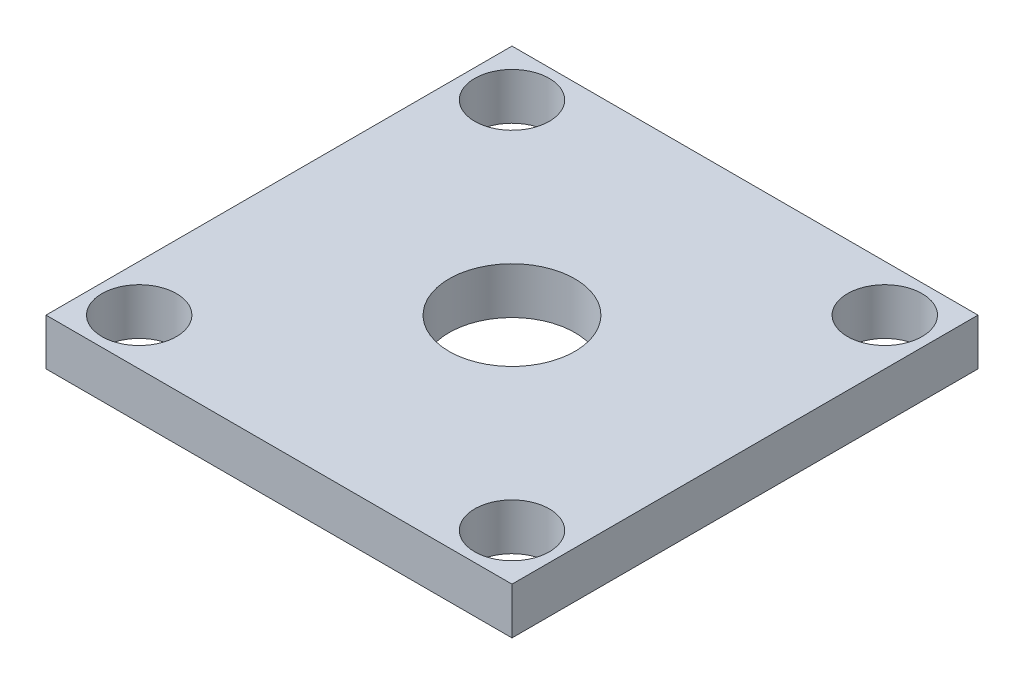
ISO-10303-21;
HEADER;
FILE_DESCRIPTION(('STEP AP214'),'2;1');
FILE_NAME('part.step','',(''),(''),'','','');
FILE_SCHEMA(('AUTOMOTIVE_DESIGN { 1 0 10303 214 1 1 1 1 }'));
ENDSEC;
DATA;
#1=APPLICATION_CONTEXT('core data for automotive mechanical design processes');
#2=APPLICATION_PROTOCOL_DEFINITION('international standard','automotive_design',2000,#1);
#3=PRODUCT_CONTEXT('',#1,'mechanical');
#4=PRODUCT('Part','Part','',(#3));
#5=PRODUCT_RELATED_PRODUCT_CATEGORY('part','',(#4));
#6=PRODUCT_DEFINITION_FORMATION('','',#4);
#7=PRODUCT_DEFINITION_CONTEXT('part definition',#1,'design');
#8=PRODUCT_DEFINITION('design','',#6,#7);
#9=PRODUCT_DEFINITION_SHAPE('','',#8);
#10=(LENGTH_UNIT() NAMED_UNIT(*) SI_UNIT(.MILLI.,.METRE.));
#11=(NAMED_UNIT(*) PLANE_ANGLE_UNIT() SI_UNIT($,.RADIAN.));
#12=(NAMED_UNIT(*) SI_UNIT($,.STERADIAN.) SOLID_ANGLE_UNIT());
#13=UNCERTAINTY_MEASURE_WITH_UNIT(LENGTH_MEASURE(1.E-05),#10,'distance_accuracy_value','');
#14=(GEOMETRIC_REPRESENTATION_CONTEXT(3) GLOBAL_UNCERTAINTY_ASSIGNED_CONTEXT((#13)) GLOBAL_UNIT_ASSIGNED_CONTEXT((#10,
#11,#12)) REPRESENTATION_CONTEXT('',''));
#15=CARTESIAN_POINT('',(0.,0.,0.));
#16=DIRECTION('',(0.,0.,1.));
#17=DIRECTION('',(1.,0.,0.));
#18=AXIS2_PLACEMENT_3D('',#15,#16,#17);
#19=CARTESIAN_POINT('',(0.,1.,5.));
#20=DIRECTION('',(0.,0.,-1.));
#21=DIRECTION('',(-1.,0.,0.));
#22=AXIS2_PLACEMENT_3D('',#19,#20,#21);
#23=PLANE('',#22);
#24=DIRECTION('',(1.,0.,0.));
#25=VECTOR('',#24,1.);
#26=CARTESIAN_POINT('',(0.,0.,5.));
#27=LINE('',#26,#25);
#28=CARTESIAN_POINT('',(-5.,0.,5.));
#29=VERTEX_POINT('',#28);
#30=CARTESIAN_POINT('',(4.99999999999999,0.,5.));
#31=VERTEX_POINT('',#30);
#32=EDGE_CURVE('E115',#29,#31,#27,.T.);
#33=ORIENTED_EDGE('',*,*,#32,.T.);
#34=DIRECTION('',(0.,-1.,0.));
#35=VECTOR('',#34,1.);
#36=CARTESIAN_POINT('',(4.99999999999999,1.,5.));
#37=LINE('',#36,#35);
#38=CARTESIAN_POINT('',(4.99999999999999,1.,5.));
#39=VERTEX_POINT('',#38);
#40=EDGE_CURVE('E11',#39,#31,#37,.T.);
#41=ORIENTED_EDGE('',*,*,#40,.F.);
#42=DIRECTION('',(1.,0.,0.));
#43=VECTOR('',#42,1.);
#44=CARTESIAN_POINT('',(0.,1.,5.));
#45=LINE('',#44,#43);
#46=CARTESIAN_POINT('',(-5.,1.,5.));
#47=VERTEX_POINT('',#46);
#48=EDGE_CURVE('E76',#47,#39,#45,.T.);
#49=ORIENTED_EDGE('',*,*,#48,.F.);
#50=DIRECTION('',(0.,-1.,0.));
#51=VECTOR('',#50,1.);
#52=CARTESIAN_POINT('',(-5.,1.,5.));
#53=LINE('',#52,#51);
#54=EDGE_CURVE('E114',#47,#29,#53,.T.);
#55=ORIENTED_EDGE('',*,*,#54,.T.);
#56=EDGE_LOOP('',(#33,#41,#49,#55));
#57=FACE_BOUND('',#56,.T.);
#58=ADVANCED_FACE('F37',(#57),#23,.F.);
#59=CARTESIAN_POINT('',(4.99999999999999,1.,0.));
#60=DIRECTION('',(1.,0.,0.));
#61=DIRECTION('',(0.,0.,-1.));
#62=AXIS2_PLACEMENT_3D('',#59,#60,#61);
#63=PLANE('',#62);
#64=DIRECTION('',(0.,0.,1.));
#65=VECTOR('',#64,1.);
#66=CARTESIAN_POINT('',(4.99999999999999,0.,0.));
#67=LINE('',#66,#65);
#68=CARTESIAN_POINT('',(4.99999999999999,0.,-5.));
#69=VERTEX_POINT('',#68);
#70=EDGE_CURVE('E85',#69,#31,#67,.T.);
#71=ORIENTED_EDGE('',*,*,#70,.F.);
#72=DIRECTION('',(0.,-1.,0.));
#73=VECTOR('',#72,1.);
#74=CARTESIAN_POINT('',(4.99999999999999,1.,-5.));
#75=LINE('',#74,#73);
#76=CARTESIAN_POINT('',(4.99999999999999,1.,-5.));
#77=VERTEX_POINT('',#76);
#78=EDGE_CURVE('E45',#77,#69,#75,.T.);
#79=ORIENTED_EDGE('',*,*,#78,.F.);
#80=DIRECTION('',(0.,0.,1.));
#81=VECTOR('',#80,1.);
#82=CARTESIAN_POINT('',(4.99999999999999,1.,0.));
#83=LINE('',#82,#81);
#84=EDGE_CURVE('E83',#77,#39,#83,.T.);
#85=ORIENTED_EDGE('',*,*,#84,.T.);
#86=ORIENTED_EDGE('',*,*,#40,.T.);
#87=EDGE_LOOP('',(#71,#79,#85,#86));
#88=FACE_BOUND('',#87,.T.);
#89=ADVANCED_FACE('F82',(#88),#63,.T.);
#90=CARTESIAN_POINT('',(0.,1.,-5.));
#91=DIRECTION('',(0.,0.,-1.));
#92=DIRECTION('',(-1.,0.,0.));
#93=AXIS2_PLACEMENT_3D('',#90,#91,#92);
#94=PLANE('',#93);
#95=DIRECTION('',(1.,0.,0.));
#96=VECTOR('',#95,1.);
#97=CARTESIAN_POINT('',(0.,0.,-5.));
#98=LINE('',#97,#96);
#99=CARTESIAN_POINT('',(-4.99999999999998,0.,-5.));
#100=VERTEX_POINT('',#99);
#101=EDGE_CURVE('E119',#100,#69,#98,.T.);
#102=ORIENTED_EDGE('',*,*,#101,.F.);
#103=DIRECTION('',(0.,-1.,0.));
#104=VECTOR('',#103,1.);
#105=CARTESIAN_POINT('',(-4.99999999999998,1.,-5.));
#106=LINE('',#105,#104);
#107=CARTESIAN_POINT('',(-4.99999999999998,1.,-5.));
#108=VERTEX_POINT('',#107);
#109=EDGE_CURVE('E68',#108,#100,#106,.T.);
#110=ORIENTED_EDGE('',*,*,#109,.F.);
#111=DIRECTION('',(1.,0.,0.));
#112=VECTOR('',#111,1.);
#113=CARTESIAN_POINT('',(0.,1.,-5.));
#114=LINE('',#113,#112);
#115=EDGE_CURVE('E92',#108,#77,#114,.T.);
#116=ORIENTED_EDGE('',*,*,#115,.T.);
#117=ORIENTED_EDGE('',*,*,#78,.T.);
#118=EDGE_LOOP('',(#102,#110,#116,#117));
#119=FACE_BOUND('',#118,.T.);
#120=ADVANCED_FACE('F94',(#119),#94,.T.);
#121=CARTESIAN_POINT('',(-4.,1.,4.00000000000001));
#122=DIRECTION('',(0.,-1.,0.));
#123=DIRECTION('',(0.,0.,-1.));
#124=AXIS2_PLACEMENT_3D('',#121,#122,#123);
#125=CYLINDRICAL_SURFACE('',#124,0.8);
#126=CARTESIAN_POINT('',(-4.,1.,4.00000000000001));
#127=DIRECTION('',(0.,1.,0.));
#128=DIRECTION('',(0.,0.,1.));
#129=AXIS2_PLACEMENT_3D('',#126,#127,#128);
#130=CIRCLE('',#129,0.8);
#131=CARTESIAN_POINT('',(-4.,1.,4.80000000000001));
#132=VERTEX_POINT('',#131);
#133=EDGE_CURVE('E108',#132,#132,#130,.T.);
#134=ORIENTED_EDGE('',*,*,#133,.T.);
#135=EDGE_LOOP('',(#134));
#136=FACE_BOUND('',#135,.T.);
#137=CARTESIAN_POINT('',(-4.,0.,4.00000000000001));
#138=DIRECTION('',(0.,1.,0.));
#139=DIRECTION('',(0.,0.,1.));
#140=AXIS2_PLACEMENT_3D('',#137,#138,#139);
#141=CIRCLE('',#140,0.8);
#142=CARTESIAN_POINT('',(-4.,0.,4.80000000000001));
#143=VERTEX_POINT('',#142);
#144=EDGE_CURVE('E131',#143,#143,#141,.T.);
#145=ORIENTED_EDGE('',*,*,#144,.F.);
#146=EDGE_LOOP('',(#145));
#147=FACE_BOUND('',#146,.T.);
#148=ADVANCED_FACE('F175',(#136,#147),#125,.F.);
#149=CARTESIAN_POINT('',(4.,1.,4.));
#150=DIRECTION('',(0.,-1.,0.));
#151=DIRECTION('',(0.,0.,-1.));
#152=AXIS2_PLACEMENT_3D('',#149,#150,#151);
#153=CYLINDRICAL_SURFACE('',#152,0.800000000000001);
#154=CARTESIAN_POINT('',(4.,1.,4.));
#155=DIRECTION('',(0.,1.,0.));
#156=DIRECTION('',(0.,0.,1.));
#157=AXIS2_PLACEMENT_3D('',#154,#155,#156);
#158=CIRCLE('',#157,0.800000000000001);
#159=CARTESIAN_POINT('',(4.,1.,4.8));
#160=VERTEX_POINT('',#159);
#161=EDGE_CURVE('E105',#160,#160,#158,.T.);
#162=ORIENTED_EDGE('',*,*,#161,.T.);
#163=EDGE_LOOP('',(#162));
#164=FACE_BOUND('',#163,.T.);
#165=CARTESIAN_POINT('',(4.,0.,4.));
#166=DIRECTION('',(0.,1.,0.));
#167=DIRECTION('',(0.,0.,1.));
#168=AXIS2_PLACEMENT_3D('',#165,#166,#167);
#169=CIRCLE('',#168,0.800000000000001);
#170=CARTESIAN_POINT('',(4.,0.,4.8));
#171=VERTEX_POINT('',#170);
#172=EDGE_CURVE('E128',#171,#171,#169,.T.);
#173=ORIENTED_EDGE('',*,*,#172,.F.);
#174=EDGE_LOOP('',(#173));
#175=FACE_BOUND('',#174,.T.);
#176=ADVANCED_FACE('F184',(#164,#175),#153,.F.);
#177=CARTESIAN_POINT('',(4.,1.,-4.00000000000001));
#178=DIRECTION('',(0.,-1.,0.));
#179=DIRECTION('',(0.,0.,-1.));
#180=AXIS2_PLACEMENT_3D('',#177,#178,#179);
#181=CYLINDRICAL_SURFACE('',#180,0.800000000000001);
#182=CARTESIAN_POINT('',(4.,1.,-4.00000000000001));
#183=DIRECTION('',(0.,1.,0.));
#184=DIRECTION('',(0.,0.,1.));
#185=AXIS2_PLACEMENT_3D('',#182,#183,#184);
#186=CIRCLE('',#185,0.800000000000001);
#187=CARTESIAN_POINT('',(4.,1.,-3.2));
#188=VERTEX_POINT('',#187);
#189=EDGE_CURVE('E102',#188,#188,#186,.T.);
#190=ORIENTED_EDGE('',*,*,#189,.T.);
#191=EDGE_LOOP('',(#190));
#192=FACE_BOUND('',#191,.T.);
#193=CARTESIAN_POINT('',(4.,0.,-4.00000000000001));
#194=DIRECTION('',(0.,1.,0.));
#195=DIRECTION('',(0.,0.,1.));
#196=AXIS2_PLACEMENT_3D('',#193,#194,#195);
#197=CIRCLE('',#196,0.800000000000001);
#198=CARTESIAN_POINT('',(4.,0.,-3.2));
#199=VERTEX_POINT('',#198);
#200=EDGE_CURVE('E125',#199,#199,#197,.T.);
#201=ORIENTED_EDGE('',*,*,#200,.F.);
#202=EDGE_LOOP('',(#201));
#203=FACE_BOUND('',#202,.T.);
#204=ADVANCED_FACE('F180',(#192,#203),#181,.F.);
#205=CARTESIAN_POINT('',(-4.,1.,-3.99999999999999));
#206=DIRECTION('',(0.,-1.,0.));
#207=DIRECTION('',(0.,0.,-1.));
#208=AXIS2_PLACEMENT_3D('',#205,#206,#207);
#209=CYLINDRICAL_SURFACE('',#208,0.8);
#210=CARTESIAN_POINT('',(-4.,1.,-3.99999999999999));
#211=DIRECTION('',(0.,1.,0.));
#212=DIRECTION('',(0.,0.,1.));
#213=AXIS2_PLACEMENT_3D('',#210,#211,#212);
#214=CIRCLE('',#213,0.8);
#215=CARTESIAN_POINT('',(-4.,1.,-3.19999999999999));
#216=VERTEX_POINT('',#215);
#217=EDGE_CURVE('E96',#216,#216,#214,.T.);
#218=ORIENTED_EDGE('',*,*,#217,.T.);
#219=EDGE_LOOP('',(#218));
#220=FACE_BOUND('',#219,.T.);
#221=CARTESIAN_POINT('',(-4.,0.,-3.99999999999999));
#222=DIRECTION('',(0.,1.,0.));
#223=DIRECTION('',(0.,0.,1.));
#224=AXIS2_PLACEMENT_3D('',#221,#222,#223);
#225=CIRCLE('',#224,0.8);
#226=CARTESIAN_POINT('',(-4.,0.,-3.19999999999999));
#227=VERTEX_POINT('',#226);
#228=EDGE_CURVE('E122',#227,#227,#225,.T.);
#229=ORIENTED_EDGE('',*,*,#228,.F.);
#230=EDGE_LOOP('',(#229));
#231=FACE_BOUND('',#230,.T.);
#232=ADVANCED_FACE('F165',(#220,#231),#209,.F.);
#233=CARTESIAN_POINT('',(-5.,1.,0.));
#234=DIRECTION('',(1.,0.,0.));
#235=DIRECTION('',(0.,0.,-1.));
#236=AXIS2_PLACEMENT_3D('',#233,#234,#235);
#237=PLANE('',#236);
#238=DIRECTION('',(0.,0.,1.));
#239=VECTOR('',#238,1.);
#240=CARTESIAN_POINT('',(-5.,0.,0.));
#241=LINE('',#240,#239);
#242=EDGE_CURVE('E71',#100,#29,#241,.T.);
#243=ORIENTED_EDGE('',*,*,#242,.T.);
#244=ORIENTED_EDGE('',*,*,#54,.F.);
#245=DIRECTION('',(0.,0.,1.));
#246=VECTOR('',#245,1.);
#247=CARTESIAN_POINT('',(-5.,1.,0.));
#248=LINE('',#247,#246);
#249=EDGE_CURVE('E53',#108,#47,#248,.T.);
#250=ORIENTED_EDGE('',*,*,#249,.F.);
#251=ORIENTED_EDGE('',*,*,#109,.T.);
#252=EDGE_LOOP('',(#243,#244,#250,#251));
#253=FACE_BOUND('',#252,.T.);
#254=ADVANCED_FACE('F157',(#253),#237,.F.);
#255=CARTESIAN_POINT('',(0.,1.,0.));
#256=DIRECTION('',(0.,-1.,0.));
#257=DIRECTION('',(0.,0.,-1.));
#258=AXIS2_PLACEMENT_3D('',#255,#256,#257);
#259=CYLINDRICAL_SURFACE('',#258,1.35);
#260=CARTESIAN_POINT('',(0.,1.,0.));
#261=DIRECTION('',(0.,1.,0.));
#262=DIRECTION('',(0.,0.,1.));
#263=AXIS2_PLACEMENT_3D('',#260,#261,#262);
#264=CIRCLE('',#263,1.35);
#265=CARTESIAN_POINT('',(0.,1.,1.35000000000001));
#266=VERTEX_POINT('',#265);
#267=EDGE_CURVE('E111',#266,#266,#264,.T.);
#268=ORIENTED_EDGE('',*,*,#267,.T.);
#269=EDGE_LOOP('',(#268));
#270=FACE_BOUND('',#269,.T.);
#271=CARTESIAN_POINT('',(0.,0.,0.));
#272=DIRECTION('',(0.,1.,0.));
#273=DIRECTION('',(0.,0.,1.));
#274=AXIS2_PLACEMENT_3D('',#271,#272,#273);
#275=CIRCLE('',#274,1.35);
#276=CARTESIAN_POINT('',(0.,0.,1.35000000000001));
#277=VERTEX_POINT('',#276);
#278=EDGE_CURVE('E134',#277,#277,#275,.T.);
#279=ORIENTED_EDGE('',*,*,#278,.F.);
#280=EDGE_LOOP('',(#279));
#281=FACE_BOUND('',#280,.T.);
#282=ADVANCED_FACE('F155',(#270,#281),#259,.F.);
#283=CARTESIAN_POINT('',(0.,1.,0.));
#284=DIRECTION('',(0.,1.,0.));
#285=DIRECTION('',(0.,0.,1.));
#286=AXIS2_PLACEMENT_3D('',#283,#284,#285);
#287=PLANE('',#286);
#288=ORIENTED_EDGE('',*,*,#48,.T.);
#289=ORIENTED_EDGE('',*,*,#84,.F.);
#290=ORIENTED_EDGE('',*,*,#115,.F.);
#291=ORIENTED_EDGE('',*,*,#249,.T.);
#292=EDGE_LOOP('',(#288,#289,#290,#291));
#293=FACE_BOUND('',#292,.T.);
#294=ORIENTED_EDGE('',*,*,#217,.F.);
#295=EDGE_LOOP('',(#294));
#296=FACE_BOUND('',#295,.T.);
#297=ORIENTED_EDGE('',*,*,#189,.F.);
#298=EDGE_LOOP('',(#297));
#299=FACE_BOUND('',#298,.T.);
#300=ORIENTED_EDGE('',*,*,#161,.F.);
#301=EDGE_LOOP('',(#300));
#302=FACE_BOUND('',#301,.T.);
#303=ORIENTED_EDGE('',*,*,#133,.F.);
#304=EDGE_LOOP('',(#303));
#305=FACE_BOUND('',#304,.T.);
#306=ORIENTED_EDGE('',*,*,#267,.F.);
#307=EDGE_LOOP('',(#306));
#308=FACE_BOUND('',#307,.T.);
#309=ADVANCED_FACE('F90',(#293,#296,#299,#302,#305,#308),#287,.T.);
#310=CARTESIAN_POINT('',(0.,0.,0.));
#311=DIRECTION('',(0.,1.,0.));
#312=DIRECTION('',(0.,0.,1.));
#313=AXIS2_PLACEMENT_3D('',#310,#311,#312);
#314=PLANE('',#313);
#315=ORIENTED_EDGE('',*,*,#32,.F.);
#316=ORIENTED_EDGE('',*,*,#242,.F.);
#317=ORIENTED_EDGE('',*,*,#101,.T.);
#318=ORIENTED_EDGE('',*,*,#70,.T.);
#319=EDGE_LOOP('',(#315,#316,#317,#318));
#320=FACE_BOUND('',#319,.T.);
#321=ORIENTED_EDGE('',*,*,#228,.T.);
#322=EDGE_LOOP('',(#321));
#323=FACE_BOUND('',#322,.T.);
#324=ORIENTED_EDGE('',*,*,#200,.T.);
#325=EDGE_LOOP('',(#324));
#326=FACE_BOUND('',#325,.T.);
#327=ORIENTED_EDGE('',*,*,#172,.T.);
#328=EDGE_LOOP('',(#327));
#329=FACE_BOUND('',#328,.T.);
#330=ORIENTED_EDGE('',*,*,#144,.T.);
#331=EDGE_LOOP('',(#330));
#332=FACE_BOUND('',#331,.T.);
#333=ORIENTED_EDGE('',*,*,#278,.T.);
#334=EDGE_LOOP('',(#333));
#335=FACE_BOUND('',#334,.T.);
#336=ADVANCED_FACE('F141',(#320,#323,#326,#329,#332,#335),#314,.F.);
#337=CLOSED_SHELL('',(#58,#89,#120,#148,#176,#204,#232,#254,#282,#309,#336));
#338=MANIFOLD_SOLID_BREP('B2',#337);
#339=ADVANCED_BREP_SHAPE_REPRESENTATION('',(#18,#338),#14);
#340=SHAPE_DEFINITION_REPRESENTATION(#9,#339);
ENDSEC;
END-ISO-10303-21;
